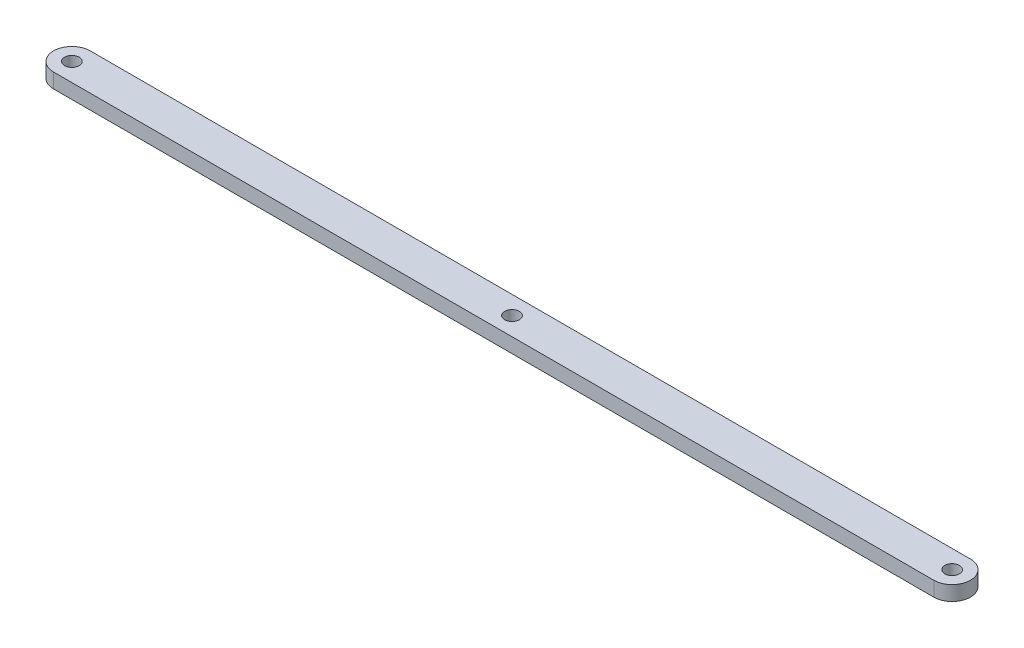
ISO-10303-21;
HEADER;
FILE_DESCRIPTION(('STEP AP214'),'2;1');
FILE_NAME('part.step','',(''),(''),'','','');
FILE_SCHEMA(('AUTOMOTIVE_DESIGN { 1 0 10303 214 1 1 1 1 }'));
ENDSEC;
DATA;
#1=APPLICATION_CONTEXT('core data for automotive mechanical design processes');
#2=APPLICATION_PROTOCOL_DEFINITION('international standard','automotive_design',2000,#1);
#3=PRODUCT_CONTEXT('',#1,'mechanical');
#4=PRODUCT('Part','Part','',(#3));
#5=PRODUCT_RELATED_PRODUCT_CATEGORY('part','',(#4));
#6=PRODUCT_DEFINITION_FORMATION('','',#4);
#7=PRODUCT_DEFINITION_CONTEXT('part definition',#1,'design');
#8=PRODUCT_DEFINITION('design','',#6,#7);
#9=PRODUCT_DEFINITION_SHAPE('','',#8);
#10=(LENGTH_UNIT() NAMED_UNIT(*) SI_UNIT(.MILLI.,.METRE.));
#11=(NAMED_UNIT(*) PLANE_ANGLE_UNIT() SI_UNIT($,.RADIAN.));
#12=(NAMED_UNIT(*) SI_UNIT($,.STERADIAN.) SOLID_ANGLE_UNIT());
#13=UNCERTAINTY_MEASURE_WITH_UNIT(LENGTH_MEASURE(1.E-05),#10,'distance_accuracy_value','');
#14=(GEOMETRIC_REPRESENTATION_CONTEXT(3) GLOBAL_UNCERTAINTY_ASSIGNED_CONTEXT((#13)) GLOBAL_UNIT_ASSIGNED_CONTEXT((#10,
#11,#12)) REPRESENTATION_CONTEXT('',''));
#15=CARTESIAN_POINT('',(0.,0.,0.));
#16=DIRECTION('',(0.,0.,1.));
#17=DIRECTION('',(1.,0.,0.));
#18=AXIS2_PLACEMENT_3D('',#15,#16,#17);
#19=CARTESIAN_POINT('',(-60.,2.,0.));
#20=DIRECTION('',(0.,1.,0.));
#21=DIRECTION('',(0.,0.,1.));
#22=AXIS2_PLACEMENT_3D('',#19,#20,#21);
#23=PLANE('',#22);
#24=CARTESIAN_POINT('',(-60.,2.,0.));
#25=DIRECTION('',(0.,1.,0.));
#26=DIRECTION('',(0.,0.,1.));
#27=AXIS2_PLACEMENT_3D('',#24,#25,#26);
#28=CIRCLE('',#27,0.999999999999998);
#29=CARTESIAN_POINT('',(-60.,2.,0.999999999999998));
#30=VERTEX_POINT('',#29);
#31=EDGE_CURVE('E119',#30,#30,#28,.T.);
#32=ORIENTED_EDGE('',*,*,#31,.F.);
#33=EDGE_LOOP('',(#32));
#34=FACE_BOUND('',#33,.T.);
#35=CARTESIAN_POINT('',(-60.,2.,0.));
#36=DIRECTION('',(0.,1.,0.));
#37=DIRECTION('',(0.,0.,1.));
#38=AXIS2_PLACEMENT_3D('',#35,#36,#37);
#39=CIRCLE('',#38,2.5);
#40=CARTESIAN_POINT('',(-60.,2.,-2.5));
#41=VERTEX_POINT('',#40);
#42=CARTESIAN_POINT('',(-60.,2.,2.5));
#43=VERTEX_POINT('',#42);
#44=EDGE_CURVE('E89',#41,#43,#39,.T.);
#45=ORIENTED_EDGE('',*,*,#44,.T.);
#46=DIRECTION('',(1.,0.,0.));
#47=VECTOR('',#46,1.);
#48=CARTESIAN_POINT('',(-60.,2.,2.5));
#49=LINE('',#48,#47);
#50=CARTESIAN_POINT('',(60.,2.,2.5));
#51=VERTEX_POINT('',#50);
#52=EDGE_CURVE('E84',#43,#51,#49,.T.);
#53=ORIENTED_EDGE('',*,*,#52,.T.);
#54=CARTESIAN_POINT('',(60.,2.,0.));
#55=DIRECTION('',(0.,1.,0.));
#56=DIRECTION('',(0.,0.,1.));
#57=AXIS2_PLACEMENT_3D('',#54,#55,#56);
#58=CIRCLE('',#57,2.5);
#59=CARTESIAN_POINT('',(60.,2.,-2.5));
#60=VERTEX_POINT('',#59);
#61=EDGE_CURVE('E87',#51,#60,#58,.T.);
#62=ORIENTED_EDGE('',*,*,#61,.T.);
#63=DIRECTION('',(-1.,0.,0.));
#64=VECTOR('',#63,1.);
#65=CARTESIAN_POINT('',(-60.,2.,-2.5));
#66=LINE('',#65,#64);
#67=EDGE_CURVE('E54',#60,#41,#66,.T.);
#68=ORIENTED_EDGE('',*,*,#67,.T.);
#69=EDGE_LOOP('',(#45,#53,#62,#68));
#70=FACE_BOUND('',#69,.T.);
#71=CARTESIAN_POINT('',(60.,2.,0.));
#72=DIRECTION('',(0.,1.,0.));
#73=DIRECTION('',(0.,0.,1.));
#74=AXIS2_PLACEMENT_3D('',#71,#72,#73);
#75=CIRCLE('',#74,0.999999999999998);
#76=CARTESIAN_POINT('',(60.,2.,0.999999999999998));
#77=VERTEX_POINT('',#76);
#78=EDGE_CURVE('E104',#77,#77,#75,.T.);
#79=ORIENTED_EDGE('',*,*,#78,.F.);
#80=EDGE_LOOP('',(#79));
#81=FACE_BOUND('',#80,.T.);
#82=CARTESIAN_POINT('',(0.,2.,0.));
#83=DIRECTION('',(0.,1.,0.));
#84=DIRECTION('',(0.,0.,1.));
#85=AXIS2_PLACEMENT_3D('',#82,#83,#84);
#86=CIRCLE('',#85,1.);
#87=CARTESIAN_POINT('',(0.,2.,1.));
#88=VERTEX_POINT('',#87);
#89=EDGE_CURVE('E125',#88,#88,#86,.T.);
#90=ORIENTED_EDGE('',*,*,#89,.F.);
#91=EDGE_LOOP('',(#90));
#92=FACE_BOUND('',#91,.T.);
#93=ADVANCED_FACE('F37',(#34,#70,#81,#92),#23,.T.);
#94=CARTESIAN_POINT('',(-60.,0.,0.));
#95=DIRECTION('',(0.,1.,0.));
#96=DIRECTION('',(0.,0.,1.));
#97=AXIS2_PLACEMENT_3D('',#94,#95,#96);
#98=PLANE('',#97);
#99=CARTESIAN_POINT('',(-60.,0.,0.));
#100=DIRECTION('',(0.,1.,0.));
#101=DIRECTION('',(0.,0.,1.));
#102=AXIS2_PLACEMENT_3D('',#99,#100,#101);
#103=CIRCLE('',#102,2.5);
#104=CARTESIAN_POINT('',(-60.,0.,-2.5));
#105=VERTEX_POINT('',#104);
#106=CARTESIAN_POINT('',(-60.,0.,2.5));
#107=VERTEX_POINT('',#106);
#108=EDGE_CURVE('E101',#105,#107,#103,.T.);
#109=ORIENTED_EDGE('',*,*,#108,.F.);
#110=DIRECTION('',(-1.,0.,0.));
#111=VECTOR('',#110,1.);
#112=CARTESIAN_POINT('',(-60.,0.,-2.5));
#113=LINE('',#112,#111);
#114=CARTESIAN_POINT('',(60.,0.,-2.5));
#115=VERTEX_POINT('',#114);
#116=EDGE_CURVE('E77',#115,#105,#113,.T.);
#117=ORIENTED_EDGE('',*,*,#116,.F.);
#118=CARTESIAN_POINT('',(60.,0.,0.));
#119=DIRECTION('',(0.,1.,0.));
#120=DIRECTION('',(0.,0.,1.));
#121=AXIS2_PLACEMENT_3D('',#118,#119,#120);
#122=CIRCLE('',#121,2.5);
#123=CARTESIAN_POINT('',(60.,0.,2.5));
#124=VERTEX_POINT('',#123);
#125=EDGE_CURVE('E71',#124,#115,#122,.T.);
#126=ORIENTED_EDGE('',*,*,#125,.F.);
#127=DIRECTION('',(1.,0.,0.));
#128=VECTOR('',#127,1.);
#129=CARTESIAN_POINT('',(-60.,0.,2.5));
#130=LINE('',#129,#128);
#131=EDGE_CURVE('E93',#107,#124,#130,.T.);
#132=ORIENTED_EDGE('',*,*,#131,.F.);
#133=EDGE_LOOP('',(#109,#117,#126,#132));
#134=FACE_BOUND('',#133,.T.);
#135=CARTESIAN_POINT('',(60.,0.,0.));
#136=DIRECTION('',(0.,1.,0.));
#137=DIRECTION('',(0.,0.,1.));
#138=AXIS2_PLACEMENT_3D('',#135,#136,#137);
#139=CIRCLE('',#138,0.999999999999998);
#140=CARTESIAN_POINT('',(60.,0.,0.999999999999998));
#141=VERTEX_POINT('',#140);
#142=EDGE_CURVE('E116',#141,#141,#139,.T.);
#143=ORIENTED_EDGE('',*,*,#142,.T.);
#144=EDGE_LOOP('',(#143));
#145=FACE_BOUND('',#144,.T.);
#146=CARTESIAN_POINT('',(-60.,0.,0.));
#147=DIRECTION('',(0.,1.,0.));
#148=DIRECTION('',(0.,0.,1.));
#149=AXIS2_PLACEMENT_3D('',#146,#147,#148);
#150=CIRCLE('',#149,0.999999999999998);
#151=CARTESIAN_POINT('',(-60.,0.,0.999999999999998));
#152=VERTEX_POINT('',#151);
#153=EDGE_CURVE('E122',#152,#152,#150,.T.);
#154=ORIENTED_EDGE('',*,*,#153,.T.);
#155=EDGE_LOOP('',(#154));
#156=FACE_BOUND('',#155,.T.);
#157=CARTESIAN_POINT('',(0.,0.,0.));
#158=DIRECTION('',(0.,1.,0.));
#159=DIRECTION('',(0.,0.,1.));
#160=AXIS2_PLACEMENT_3D('',#157,#158,#159);
#161=CIRCLE('',#160,1.);
#162=CARTESIAN_POINT('',(0.,0.,1.));
#163=VERTEX_POINT('',#162);
#164=EDGE_CURVE('E128',#163,#163,#161,.T.);
#165=ORIENTED_EDGE('',*,*,#164,.T.);
#166=EDGE_LOOP('',(#165));
#167=FACE_BOUND('',#166,.T.);
#168=ADVANCED_FACE('F112',(#134,#145,#156,#167),#98,.F.);
#169=CARTESIAN_POINT('',(-60.,2.,0.));
#170=DIRECTION('',(0.,-1.,0.));
#171=DIRECTION('',(0.,0.,-1.));
#172=AXIS2_PLACEMENT_3D('',#169,#170,#171);
#173=CYLINDRICAL_SURFACE('',#172,2.5);
#174=ORIENTED_EDGE('',*,*,#108,.T.);
#175=DIRECTION('',(0.,-1.,0.));
#176=VECTOR('',#175,1.);
#177=CARTESIAN_POINT('',(-60.,2.,2.5));
#178=LINE('',#177,#176);
#179=EDGE_CURVE('E11',#43,#107,#178,.T.);
#180=ORIENTED_EDGE('',*,*,#179,.F.);
#181=ORIENTED_EDGE('',*,*,#44,.F.);
#182=DIRECTION('',(0.,-1.,0.));
#183=VECTOR('',#182,1.);
#184=CARTESIAN_POINT('',(-60.,2.,-2.5));
#185=LINE('',#184,#183);
#186=EDGE_CURVE('E97',#41,#105,#185,.T.);
#187=ORIENTED_EDGE('',*,*,#186,.T.);
#188=EDGE_LOOP('',(#174,#180,#181,#187));
#189=FACE_BOUND('',#188,.T.);
#190=ADVANCED_FACE('F39',(#189),#173,.T.);
#191=CARTESIAN_POINT('',(-60.,2.,2.5));
#192=DIRECTION('',(0.,0.,-1.));
#193=DIRECTION('',(-1.,0.,0.));
#194=AXIS2_PLACEMENT_3D('',#191,#192,#193);
#195=PLANE('',#194);
#196=ORIENTED_EDGE('',*,*,#131,.T.);
#197=DIRECTION('',(0.,-1.,0.));
#198=VECTOR('',#197,1.);
#199=CARTESIAN_POINT('',(60.,2.,2.5));
#200=LINE('',#199,#198);
#201=EDGE_CURVE('E46',#51,#124,#200,.T.);
#202=ORIENTED_EDGE('',*,*,#201,.F.);
#203=ORIENTED_EDGE('',*,*,#52,.F.);
#204=ORIENTED_EDGE('',*,*,#179,.T.);
#205=EDGE_LOOP('',(#196,#202,#203,#204));
#206=FACE_BOUND('',#205,.T.);
#207=ADVANCED_FACE('F92',(#206),#195,.F.);
#208=CARTESIAN_POINT('',(60.,2.,0.));
#209=DIRECTION('',(0.,-1.,0.));
#210=DIRECTION('',(0.,0.,-1.));
#211=AXIS2_PLACEMENT_3D('',#208,#209,#210);
#212=CYLINDRICAL_SURFACE('',#211,2.5);
#213=ORIENTED_EDGE('',*,*,#125,.T.);
#214=DIRECTION('',(0.,-1.,0.));
#215=VECTOR('',#214,1.);
#216=CARTESIAN_POINT('',(60.,2.,-2.5));
#217=LINE('',#216,#215);
#218=EDGE_CURVE('E94',#60,#115,#217,.T.);
#219=ORIENTED_EDGE('',*,*,#218,.F.);
#220=ORIENTED_EDGE('',*,*,#61,.F.);
#221=ORIENTED_EDGE('',*,*,#201,.T.);
#222=EDGE_LOOP('',(#213,#219,#220,#221));
#223=FACE_BOUND('',#222,.T.);
#224=ADVANCED_FACE('F95',(#223),#212,.T.);
#225=CARTESIAN_POINT('',(-60.,2.,-2.5));
#226=DIRECTION('',(0.,0.,1.));
#227=DIRECTION('',(1.,0.,0.));
#228=AXIS2_PLACEMENT_3D('',#225,#226,#227);
#229=PLANE('',#228);
#230=ORIENTED_EDGE('',*,*,#116,.T.);
#231=ORIENTED_EDGE('',*,*,#186,.F.);
#232=ORIENTED_EDGE('',*,*,#67,.F.);
#233=ORIENTED_EDGE('',*,*,#218,.T.);
#234=EDGE_LOOP('',(#230,#231,#232,#233));
#235=FACE_BOUND('',#234,.T.);
#236=ADVANCED_FACE('F109',(#235),#229,.F.);
#237=CARTESIAN_POINT('',(60.,2.,0.));
#238=DIRECTION('',(0.,-1.,0.));
#239=DIRECTION('',(0.,0.,-1.));
#240=AXIS2_PLACEMENT_3D('',#237,#238,#239);
#241=CYLINDRICAL_SURFACE('',#240,0.999999999999998);
#242=ORIENTED_EDGE('',*,*,#78,.T.);
#243=EDGE_LOOP('',(#242));
#244=FACE_BOUND('',#243,.T.);
#245=ORIENTED_EDGE('',*,*,#142,.F.);
#246=EDGE_LOOP('',(#245));
#247=FACE_BOUND('',#246,.T.);
#248=ADVANCED_FACE('F146',(#244,#247),#241,.F.);
#249=CARTESIAN_POINT('',(-60.,2.,0.));
#250=DIRECTION('',(0.,-1.,0.));
#251=DIRECTION('',(0.,0.,-1.));
#252=AXIS2_PLACEMENT_3D('',#249,#250,#251);
#253=CYLINDRICAL_SURFACE('',#252,0.999999999999998);
#254=ORIENTED_EDGE('',*,*,#31,.T.);
#255=EDGE_LOOP('',(#254));
#256=FACE_BOUND('',#255,.T.);
#257=ORIENTED_EDGE('',*,*,#153,.F.);
#258=EDGE_LOOP('',(#257));
#259=FACE_BOUND('',#258,.T.);
#260=ADVANCED_FACE('F200',(#256,#259),#253,.F.);
#261=CARTESIAN_POINT('',(0.,2.,0.));
#262=DIRECTION('',(0.,-1.,0.));
#263=DIRECTION('',(0.,0.,-1.));
#264=AXIS2_PLACEMENT_3D('',#261,#262,#263);
#265=CYLINDRICAL_SURFACE('',#264,1.);
#266=ORIENTED_EDGE('',*,*,#89,.T.);
#267=EDGE_LOOP('',(#266));
#268=FACE_BOUND('',#267,.T.);
#269=ORIENTED_EDGE('',*,*,#164,.F.);
#270=EDGE_LOOP('',(#269));
#271=FACE_BOUND('',#270,.T.);
#272=ADVANCED_FACE('F134',(#268,#271),#265,.F.);
#273=CLOSED_SHELL('',(#93,#168,#190,#207,#224,#236,#248,#260,#272));
#274=MANIFOLD_SOLID_BREP('B2',#273);
#275=ADVANCED_BREP_SHAPE_REPRESENTATION('',(#18,#274),#14);
#276=SHAPE_DEFINITION_REPRESENTATION(#9,#275);
ENDSEC;
END-ISO-10303-21;
